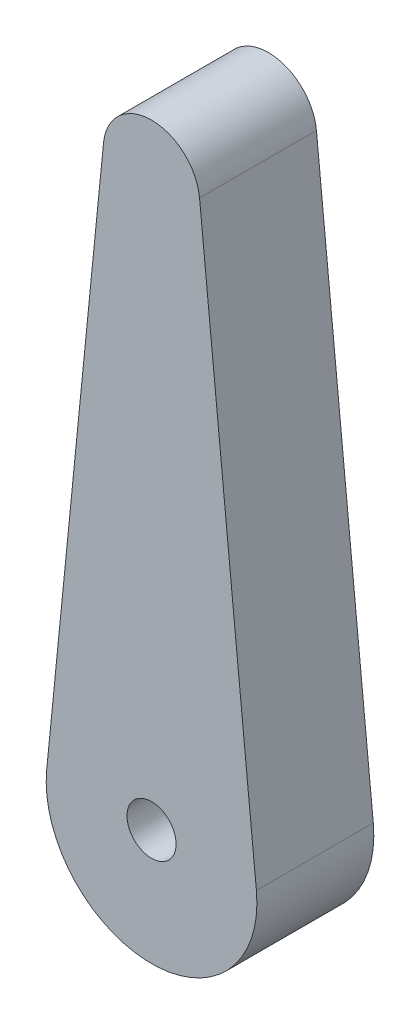
ISO-10303-21;
HEADER;
FILE_DESCRIPTION(('STEP AP214'),'2;1');
FILE_NAME('part.step','',(''),(''),'','','');
FILE_SCHEMA(('AUTOMOTIVE_DESIGN { 1 0 10303 214 1 1 1 1 }'));
ENDSEC;
DATA;
#1=APPLICATION_CONTEXT('core data for automotive mechanical design processes');
#2=APPLICATION_PROTOCOL_DEFINITION('international standard','automotive_design',2000,#1);
#3=PRODUCT_CONTEXT('',#1,'mechanical');
#4=PRODUCT('Part','Part','',(#3));
#5=PRODUCT_RELATED_PRODUCT_CATEGORY('part','',(#4));
#6=PRODUCT_DEFINITION_FORMATION('','',#4);
#7=PRODUCT_DEFINITION_CONTEXT('part definition',#1,'design');
#8=PRODUCT_DEFINITION('design','',#6,#7);
#9=PRODUCT_DEFINITION_SHAPE('','',#8);
#10=(LENGTH_UNIT() NAMED_UNIT(*) SI_UNIT(.MILLI.,.METRE.));
#11=(NAMED_UNIT(*) PLANE_ANGLE_UNIT() SI_UNIT($,.RADIAN.));
#12=(NAMED_UNIT(*) SI_UNIT($,.STERADIAN.) SOLID_ANGLE_UNIT());
#13=UNCERTAINTY_MEASURE_WITH_UNIT(LENGTH_MEASURE(1.E-05),#10,'distance_accuracy_value','');
#14=(GEOMETRIC_REPRESENTATION_CONTEXT(3) GLOBAL_UNCERTAINTY_ASSIGNED_CONTEXT((#13)) GLOBAL_UNIT_ASSIGNED_CONTEXT((#10,
#11,#12)) REPRESENTATION_CONTEXT('',''));
#15=CARTESIAN_POINT('',(0.,0.,0.));
#16=DIRECTION('',(0.,0.,1.));
#17=DIRECTION('',(1.,0.,0.));
#18=AXIS2_PLACEMENT_3D('',#15,#16,#17);
#19=CARTESIAN_POINT('',(0.,-1.78462261379392,20.));
#20=DIRECTION('',(0.,0.,-1.));
#21=DIRECTION('',(-1.,0.,0.));
#22=AXIS2_PLACEMENT_3D('',#19,#20,#21);
#23=CYLINDRICAL_SURFACE('',#22,18.0260965447233);
#24=CARTESIAN_POINT('',(0.,-1.78462261379392,0.));
#25=DIRECTION('',(0.,0.,1.));
#26=DIRECTION('',(1.,0.,0.));
#27=AXIS2_PLACEMENT_3D('',#24,#25,#26);
#28=CIRCLE('',#27,18.0260965447233);
#29=CARTESIAN_POINT('',(-17.9375382582455,0.,0.));
#30=VERTEX_POINT('',#29);
#31=CARTESIAN_POINT('',(17.9375382582456,0.,0.));
#32=VERTEX_POINT('',#31);
#33=EDGE_CURVE('E113',#30,#32,#28,.T.);
#34=ORIENTED_EDGE('',*,*,#33,.T.);
#35=DIRECTION('',(0.,0.,-1.));
#36=VECTOR('',#35,1.);
#37=CARTESIAN_POINT('',(17.9375382582456,0.,20.));
#38=LINE('',#37,#36);
#39=CARTESIAN_POINT('',(17.9375382582456,0.,20.));
#40=VERTEX_POINT('',#39);
#41=EDGE_CURVE('E11',#40,#32,#38,.T.);
#42=ORIENTED_EDGE('',*,*,#41,.F.);
#43=CARTESIAN_POINT('',(0.,-1.78462261379392,20.));
#44=DIRECTION('',(0.,0.,1.));
#45=DIRECTION('',(1.,0.,0.));
#46=AXIS2_PLACEMENT_3D('',#43,#44,#45);
#47=CIRCLE('',#46,18.0260965447233);
#48=CARTESIAN_POINT('',(-17.9375382582455,0.,20.));
#49=VERTEX_POINT('',#48);
#50=EDGE_CURVE('E97',#49,#40,#47,.T.);
#51=ORIENTED_EDGE('',*,*,#50,.F.);
#52=DIRECTION('',(0.,0.,-1.));
#53=VECTOR('',#52,1.);
#54=CARTESIAN_POINT('',(-17.9375382582455,0.,20.));
#55=LINE('',#54,#53);
#56=EDGE_CURVE('E109',#49,#30,#55,.T.);
#57=ORIENTED_EDGE('',*,*,#56,.T.);
#58=EDGE_LOOP('',(#34,#42,#51,#57));
#59=FACE_BOUND('',#58,.T.);
#60=ADVANCED_FACE('F45',(#59),#23,.T.);
#61=CARTESIAN_POINT('',(8.21191718507236,97.7538325116098,20.));
#62=DIRECTION('',(-0.995087217786829,-0.0990021666291549,0.));
#63=DIRECTION('',(0.0990021666291549,-0.99508721778683,0.));
#64=AXIS2_PLACEMENT_3D('',#61,#62,#63);
#65=PLANE('',#64);
#66=DIRECTION('',(-0.0990021666291549,0.99508721778683,0.));
#67=VECTOR('',#66,1.);
#68=CARTESIAN_POINT('',(8.21191718507236,97.7538325116098,0.));
#69=LINE('',#68,#67);
#70=CARTESIAN_POINT('',(8.21191718507236,97.7538325116098,0.));
#71=VERTEX_POINT('',#70);
#72=EDGE_CURVE('E102',#32,#71,#69,.T.);
#73=ORIENTED_EDGE('',*,*,#72,.T.);
#74=DIRECTION('',(0.,0.,-1.));
#75=VECTOR('',#74,1.);
#76=CARTESIAN_POINT('',(8.21191718507236,97.7538325116098,20.));
#77=LINE('',#76,#75);
#78=CARTESIAN_POINT('',(8.21191718507236,97.7538325116098,20.));
#79=VERTEX_POINT('',#78);
#80=EDGE_CURVE('E54',#79,#71,#77,.T.);
#81=ORIENTED_EDGE('',*,*,#80,.F.);
#82=DIRECTION('',(-0.0990021666291549,0.99508721778683,0.));
#83=VECTOR('',#82,1.);
#84=CARTESIAN_POINT('',(8.21191718507236,97.7538325116098,20.));
#85=LINE('',#84,#83);
#86=EDGE_CURVE('E92',#40,#79,#85,.T.);
#87=ORIENTED_EDGE('',*,*,#86,.F.);
#88=ORIENTED_EDGE('',*,*,#41,.T.);
#89=EDGE_LOOP('',(#73,#81,#87,#88));
#90=FACE_BOUND('',#89,.T.);
#91=ADVANCED_FACE('F101',(#90),#65,.F.);
#92=CARTESIAN_POINT('',(0.,96.9368211190712,20.));
#93=DIRECTION('',(0.,0.,-1.));
#94=DIRECTION('',(-1.,0.,0.));
#95=AXIS2_PLACEMENT_3D('',#92,#93,#94);
#96=CYLINDRICAL_SURFACE('',#95,8.25245972241153);
#97=CARTESIAN_POINT('',(0.,96.9368211190712,0.));
#98=DIRECTION('',(0.,0.,1.));
#99=DIRECTION('',(-1.,0.,0.));
#100=AXIS2_PLACEMENT_3D('',#97,#98,#99);
#101=CIRCLE('',#100,8.25245972241153);
#102=CARTESIAN_POINT('',(-8.21191718507236,97.7538325116098,0.));
#103=VERTEX_POINT('',#102);
#104=EDGE_CURVE('E79',#71,#103,#101,.T.);
#105=ORIENTED_EDGE('',*,*,#104,.T.);
#106=DIRECTION('',(0.,0.,-1.));
#107=VECTOR('',#106,1.);
#108=CARTESIAN_POINT('',(-8.21191718507236,97.7538325116098,20.));
#109=LINE('',#108,#107);
#110=CARTESIAN_POINT('',(-8.21191718507236,97.7538325116098,20.));
#111=VERTEX_POINT('',#110);
#112=EDGE_CURVE('E104',#111,#103,#109,.T.);
#113=ORIENTED_EDGE('',*,*,#112,.F.);
#114=CARTESIAN_POINT('',(0.,96.9368211190712,20.));
#115=DIRECTION('',(0.,0.,1.));
#116=DIRECTION('',(-1.,0.,0.));
#117=AXIS2_PLACEMENT_3D('',#114,#115,#116);
#118=CIRCLE('',#117,8.25245972241153);
#119=EDGE_CURVE('E95',#79,#111,#118,.T.);
#120=ORIENTED_EDGE('',*,*,#119,.F.);
#121=ORIENTED_EDGE('',*,*,#80,.T.);
#122=EDGE_LOOP('',(#105,#113,#120,#121));
#123=FACE_BOUND('',#122,.T.);
#124=ADVANCED_FACE('F105',(#123),#96,.T.);
#125=CARTESIAN_POINT('',(-17.9375382582455,0.,20.));
#126=DIRECTION('',(0.99508721778683,-0.0990021666291541,0.));
#127=DIRECTION('',(0.0990021666291542,0.99508721778683,0.));
#128=AXIS2_PLACEMENT_3D('',#125,#126,#127);
#129=PLANE('',#128);
#130=DIRECTION('',(-0.0990021666291541,-0.99508721778683,0.));
#131=VECTOR('',#130,1.);
#132=CARTESIAN_POINT('',(-17.9375382582455,0.,0.));
#133=LINE('',#132,#131);
#134=EDGE_CURVE('E85',#103,#30,#133,.T.);
#135=ORIENTED_EDGE('',*,*,#134,.T.);
#136=ORIENTED_EDGE('',*,*,#56,.F.);
#137=DIRECTION('',(-0.0990021666291541,-0.99508721778683,0.));
#138=VECTOR('',#137,1.);
#139=CARTESIAN_POINT('',(-17.9375382582455,0.,20.));
#140=LINE('',#139,#138);
#141=EDGE_CURVE('E62',#111,#49,#140,.T.);
#142=ORIENTED_EDGE('',*,*,#141,.F.);
#143=ORIENTED_EDGE('',*,*,#112,.T.);
#144=EDGE_LOOP('',(#135,#136,#142,#143));
#145=FACE_BOUND('',#144,.T.);
#146=ADVANCED_FACE('F127',(#145),#129,.F.);
#147=CARTESIAN_POINT('',(0.,-1.78462261379392,20.));
#148=DIRECTION('',(0.,0.,1.));
#149=DIRECTION('',(1.,0.,0.));
#150=AXIS2_PLACEMENT_3D('',#147,#148,#149);
#151=PLANE('',#150);
#152=CARTESIAN_POINT('',(0.,0.,20.));
#153=DIRECTION('',(0.,0.,1.));
#154=DIRECTION('',(1.,0.,0.));
#155=AXIS2_PLACEMENT_3D('',#152,#153,#154);
#156=CIRCLE('',#155,4.2);
#157=CARTESIAN_POINT('',(4.2,0.,20.));
#158=VERTEX_POINT('',#157);
#159=EDGE_CURVE('E134',#158,#158,#156,.T.);
#160=ORIENTED_EDGE('',*,*,#159,.F.);
#161=EDGE_LOOP('',(#160));
#162=FACE_BOUND('',#161,.T.);
#163=ORIENTED_EDGE('',*,*,#50,.T.);
#164=ORIENTED_EDGE('',*,*,#86,.T.);
#165=ORIENTED_EDGE('',*,*,#119,.T.);
#166=ORIENTED_EDGE('',*,*,#141,.T.);
#167=EDGE_LOOP('',(#163,#164,#165,#166));
#168=FACE_BOUND('',#167,.T.);
#169=ADVANCED_FACE('F93',(#162,#168),#151,.T.);
#170=CARTESIAN_POINT('',(0.,-1.78462261379392,0.));
#171=DIRECTION('',(0.,0.,1.));
#172=DIRECTION('',(1.,0.,0.));
#173=AXIS2_PLACEMENT_3D('',#170,#171,#172);
#174=PLANE('',#173);
#175=ORIENTED_EDGE('',*,*,#33,.F.);
#176=ORIENTED_EDGE('',*,*,#134,.F.);
#177=ORIENTED_EDGE('',*,*,#104,.F.);
#178=ORIENTED_EDGE('',*,*,#72,.F.);
#179=EDGE_LOOP('',(#175,#176,#177,#178));
#180=FACE_BOUND('',#179,.T.);
#181=ADVANCED_FACE('F130',(#180),#174,.F.);
#182=CARTESIAN_POINT('',(0.,0.,2.50000000000001));
#183=DIRECTION('',(0.,0.,1.));
#184=DIRECTION('',(1.,0.,0.));
#185=AXIS2_PLACEMENT_3D('',#182,#183,#184);
#186=CYLINDRICAL_SURFACE('',#185,4.2);
#187=CARTESIAN_POINT('',(0.,0.,2.50000000000001));
#188=DIRECTION('',(0.,0.,1.));
#189=DIRECTION('',(1.,0.,0.));
#190=AXIS2_PLACEMENT_3D('',#187,#188,#189);
#191=CIRCLE('',#190,4.2);
#192=CARTESIAN_POINT('',(4.2,0.,2.50000000000001));
#193=VERTEX_POINT('',#192);
#194=EDGE_CURVE('E117',#193,#193,#191,.T.);
#195=ORIENTED_EDGE('',*,*,#194,.F.);
#196=EDGE_LOOP('',(#195));
#197=FACE_BOUND('',#196,.T.);
#198=ORIENTED_EDGE('',*,*,#159,.T.);
#199=EDGE_LOOP('',(#198));
#200=FACE_BOUND('',#199,.T.);
#201=ADVANCED_FACE('F144',(#197,#200),#186,.F.);
#202=CARTESIAN_POINT('',(0.,0.,2.50000000000001));
#203=DIRECTION('',(0.,0.,1.));
#204=DIRECTION('',(1.,0.,0.));
#205=AXIS2_PLACEMENT_3D('',#202,#203,#204);
#206=PLANE('',#205);
#207=ORIENTED_EDGE('',*,*,#194,.T.);
#208=EDGE_LOOP('',(#207));
#209=FACE_BOUND('',#208,.T.);
#210=ADVANCED_FACE('F142',(#209),#206,.T.);
#211=CLOSED_SHELL('',(#60,#91,#124,#146,#169,#181,#201,#210));
#212=MANIFOLD_SOLID_BREP('B2',#211);
#213=ADVANCED_BREP_SHAPE_REPRESENTATION('',(#18,#212),#14);
#214=SHAPE_DEFINITION_REPRESENTATION(#9,#213);
ENDSEC;
END-ISO-10303-21;
